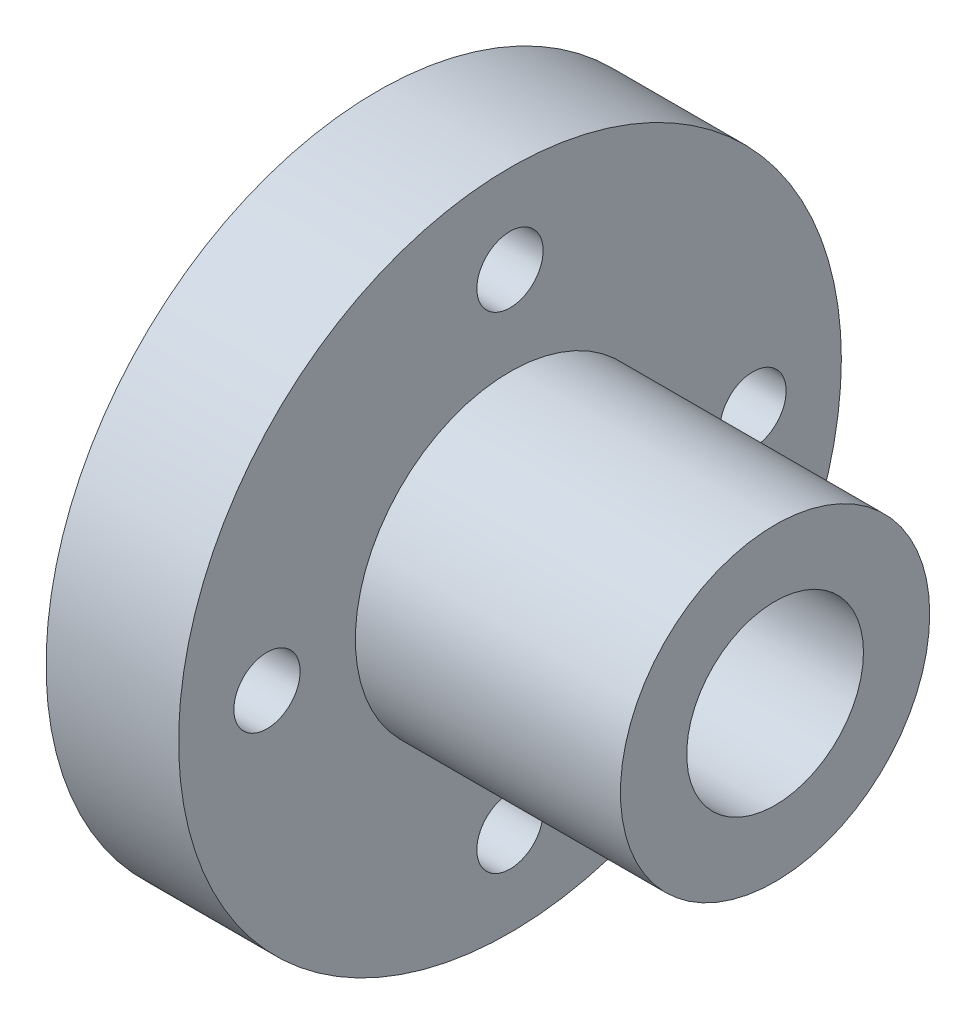
ISO-10303-21;
HEADER;
FILE_DESCRIPTION(('STEP AP214'),'2;1');
FILE_NAME('part.step','',(''),(''),'','','');
FILE_SCHEMA(('AUTOMOTIVE_DESIGN { 1 0 10303 214 1 1 1 1 }'));
ENDSEC;
DATA;
#1=APPLICATION_CONTEXT('core data for automotive mechanical design processes');
#2=APPLICATION_PROTOCOL_DEFINITION('international standard','automotive_design',2000,#1);
#3=PRODUCT_CONTEXT('',#1,'mechanical');
#4=PRODUCT('Part','Part','',(#3));
#5=PRODUCT_RELATED_PRODUCT_CATEGORY('part','',(#4));
#6=PRODUCT_DEFINITION_FORMATION('','',#4);
#7=PRODUCT_DEFINITION_CONTEXT('part definition',#1,'design');
#8=PRODUCT_DEFINITION('design','',#6,#7);
#9=PRODUCT_DEFINITION_SHAPE('','',#8);
#10=(LENGTH_UNIT() NAMED_UNIT(*) SI_UNIT(.MILLI.,.METRE.));
#11=(NAMED_UNIT(*) PLANE_ANGLE_UNIT() SI_UNIT($,.RADIAN.));
#12=(NAMED_UNIT(*) SI_UNIT($,.STERADIAN.) SOLID_ANGLE_UNIT());
#13=UNCERTAINTY_MEASURE_WITH_UNIT(LENGTH_MEASURE(1.E-05),#10,'distance_accuracy_value','');
#14=(GEOMETRIC_REPRESENTATION_CONTEXT(3) GLOBAL_UNCERTAINTY_ASSIGNED_CONTEXT((#13)) GLOBAL_UNIT_ASSIGNED_CONTEXT((#10,
#11,#12)) REPRESENTATION_CONTEXT('',''));
#15=CARTESIAN_POINT('',(0.,0.,0.));
#16=DIRECTION('',(0.,0.,1.));
#17=DIRECTION('',(1.,0.,0.));
#18=AXIS2_PLACEMENT_3D('',#15,#16,#17);
#19=CARTESIAN_POINT('',(8.,0.,0.));
#20=DIRECTION('',(1.,0.,0.));
#21=DIRECTION('',(0.,0.,-1.));
#22=AXIS2_PLACEMENT_3D('',#19,#20,#21);
#23=CYLINDRICAL_SURFACE('',#22,7.);
#24=CARTESIAN_POINT('',(0.,0.,0.));
#25=DIRECTION('',(1.,0.,0.));
#26=DIRECTION('',(0.,0.,-1.));
#27=AXIS2_PLACEMENT_3D('',#24,#25,#26);
#28=CIRCLE('',#27,6.99999999999999);
#29=CARTESIAN_POINT('',(0.,0.,-6.99999999999999));
#30=VERTEX_POINT('',#29);
#31=EDGE_CURVE('E10',#30,#30,#28,.T.);
#32=ORIENTED_EDGE('',*,*,#31,.T.);
#33=EDGE_LOOP('',(#32));
#34=FACE_BOUND('',#33,.T.);
#35=CARTESIAN_POINT('',(2.,0.,0.));
#36=DIRECTION('',(1.,0.,0.));
#37=DIRECTION('',(0.,0.,-1.));
#38=AXIS2_PLACEMENT_3D('',#35,#36,#37);
#39=CIRCLE('',#38,7.);
#40=CARTESIAN_POINT('',(2.,0.,-7.));
#41=VERTEX_POINT('',#40);
#42=EDGE_CURVE('E58',#41,#41,#39,.T.);
#43=ORIENTED_EDGE('',*,*,#42,.F.);
#44=EDGE_LOOP('',(#43));
#45=FACE_BOUND('',#44,.T.);
#46=ADVANCED_FACE('F30',(#34,#45),#23,.T.);
#47=CARTESIAN_POINT('',(0.,3.99999999999999,0.));
#48=DIRECTION('',(-1.,0.,0.));
#49=DIRECTION('',(0.,0.,1.));
#50=AXIS2_PLACEMENT_3D('',#47,#48,#49);
#51=PLANE('',#50);
#52=CARTESIAN_POINT('',(0.,0.,0.));
#53=DIRECTION('',(1.,0.,0.));
#54=DIRECTION('',(0.,0.,-1.));
#55=AXIS2_PLACEMENT_3D('',#52,#53,#54);
#56=CIRCLE('',#55,3.99999999999999);
#57=CARTESIAN_POINT('',(0.,0.,-3.99999999999999));
#58=VERTEX_POINT('',#57);
#59=EDGE_CURVE('E36',#58,#58,#56,.T.);
#60=ORIENTED_EDGE('',*,*,#59,.T.);
#61=EDGE_LOOP('',(#60));
#62=FACE_BOUND('',#61,.T.);
#63=ORIENTED_EDGE('',*,*,#31,.F.);
#64=EDGE_LOOP('',(#63));
#65=FACE_BOUND('',#64,.T.);
#66=ADVANCED_FACE('F131',(#62,#65),#51,.T.);
#67=CARTESIAN_POINT('',(8.,0.,0.));
#68=DIRECTION('',(1.,0.,0.));
#69=DIRECTION('',(0.,0.,-1.));
#70=AXIS2_PLACEMENT_3D('',#67,#68,#69);
#71=CYLINDRICAL_SURFACE('',#70,4.);
#72=CARTESIAN_POINT('',(20.,0.,0.));
#73=DIRECTION('',(1.,0.,0.));
#74=DIRECTION('',(0.,0.,-1.));
#75=AXIS2_PLACEMENT_3D('',#72,#73,#74);
#76=CIRCLE('',#75,4.);
#77=CARTESIAN_POINT('',(20.,0.,-4.));
#78=VERTEX_POINT('',#77);
#79=EDGE_CURVE('E40',#78,#78,#76,.T.);
#80=ORIENTED_EDGE('',*,*,#79,.T.);
#81=EDGE_LOOP('',(#80));
#82=FACE_BOUND('',#81,.T.);
#83=ORIENTED_EDGE('',*,*,#59,.F.);
#84=EDGE_LOOP('',(#83));
#85=FACE_BOUND('',#84,.T.);
#86=ADVANCED_FACE('F125',(#82,#85),#71,.F.);
#87=CARTESIAN_POINT('',(20.,7.,0.));
#88=DIRECTION('',(1.,0.,0.));
#89=DIRECTION('',(0.,0.,-1.));
#90=AXIS2_PLACEMENT_3D('',#87,#88,#89);
#91=PLANE('',#90);
#92=CARTESIAN_POINT('',(20.,0.,0.));
#93=DIRECTION('',(1.,0.,0.));
#94=DIRECTION('',(0.,0.,-1.));
#95=AXIS2_PLACEMENT_3D('',#92,#93,#94);
#96=CIRCLE('',#95,7.);
#97=CARTESIAN_POINT('',(20.,0.,-7.));
#98=VERTEX_POINT('',#97);
#99=EDGE_CURVE('E44',#98,#98,#96,.T.);
#100=ORIENTED_EDGE('',*,*,#99,.T.);
#101=EDGE_LOOP('',(#100));
#102=FACE_BOUND('',#101,.T.);
#103=ORIENTED_EDGE('',*,*,#79,.F.);
#104=EDGE_LOOP('',(#103));
#105=FACE_BOUND('',#104,.T.);
#106=ADVANCED_FACE('F119',(#102,#105),#91,.T.);
#107=CARTESIAN_POINT('',(8.,0.,0.));
#108=DIRECTION('',(1.,0.,0.));
#109=DIRECTION('',(0.,0.,-1.));
#110=AXIS2_PLACEMENT_3D('',#107,#108,#109);
#111=CYLINDRICAL_SURFACE('',#110,7.);
#112=CARTESIAN_POINT('',(8.,0.,0.));
#113=DIRECTION('',(1.,0.,0.));
#114=DIRECTION('',(0.,0.,-1.));
#115=AXIS2_PLACEMENT_3D('',#112,#113,#114);
#116=CIRCLE('',#115,7.);
#117=CARTESIAN_POINT('',(8.,0.,-7.));
#118=VERTEX_POINT('',#117);
#119=EDGE_CURVE('E49',#118,#118,#116,.T.);
#120=ORIENTED_EDGE('',*,*,#119,.T.);
#121=EDGE_LOOP('',(#120));
#122=FACE_BOUND('',#121,.T.);
#123=ORIENTED_EDGE('',*,*,#99,.F.);
#124=EDGE_LOOP('',(#123));
#125=FACE_BOUND('',#124,.T.);
#126=ADVANCED_FACE('F112',(#122,#125),#111,.T.);
#127=CARTESIAN_POINT('',(8.,15.,0.));
#128=DIRECTION('',(1.,0.,0.));
#129=DIRECTION('',(0.,0.,-1.));
#130=AXIS2_PLACEMENT_3D('',#127,#128,#129);
#131=PLANE('',#130);
#132=CARTESIAN_POINT('',(8.,0.,11.));
#133=DIRECTION('',(1.,0.,0.));
#134=DIRECTION('',(0.,0.,-1.));
#135=AXIS2_PLACEMENT_3D('',#132,#133,#134);
#136=CIRCLE('',#135,1.5);
#137=CARTESIAN_POINT('',(8.,0.,9.5));
#138=VERTEX_POINT('',#137);
#139=EDGE_CURVE('E79',#138,#138,#136,.T.);
#140=ORIENTED_EDGE('',*,*,#139,.F.);
#141=EDGE_LOOP('',(#140));
#142=FACE_BOUND('',#141,.T.);
#143=CARTESIAN_POINT('',(8.,-11.,0.));
#144=DIRECTION('',(1.,0.,0.));
#145=DIRECTION('',(0.,0.,-1.));
#146=AXIS2_PLACEMENT_3D('',#143,#144,#145);
#147=CIRCLE('',#146,1.5);
#148=CARTESIAN_POINT('',(8.,-11.,-1.5));
#149=VERTEX_POINT('',#148);
#150=EDGE_CURVE('E73',#149,#149,#147,.T.);
#151=ORIENTED_EDGE('',*,*,#150,.F.);
#152=EDGE_LOOP('',(#151));
#153=FACE_BOUND('',#152,.T.);
#154=CARTESIAN_POINT('',(8.,0.,-11.));
#155=DIRECTION('',(1.,0.,0.));
#156=DIRECTION('',(0.,0.,-1.));
#157=AXIS2_PLACEMENT_3D('',#154,#155,#156);
#158=CIRCLE('',#157,1.5);
#159=CARTESIAN_POINT('',(8.,0.,-12.5));
#160=VERTEX_POINT('',#159);
#161=EDGE_CURVE('E67',#160,#160,#158,.T.);
#162=ORIENTED_EDGE('',*,*,#161,.F.);
#163=EDGE_LOOP('',(#162));
#164=FACE_BOUND('',#163,.T.);
#165=CARTESIAN_POINT('',(8.,11.,0.));
#166=DIRECTION('',(1.,0.,0.));
#167=DIRECTION('',(0.,0.,-1.));
#168=AXIS2_PLACEMENT_3D('',#165,#166,#167);
#169=CIRCLE('',#168,1.5);
#170=CARTESIAN_POINT('',(8.,11.,-1.5));
#171=VERTEX_POINT('',#170);
#172=EDGE_CURVE('E61',#171,#171,#169,.T.);
#173=ORIENTED_EDGE('',*,*,#172,.F.);
#174=EDGE_LOOP('',(#173));
#175=FACE_BOUND('',#174,.T.);
#176=CARTESIAN_POINT('',(8.,0.,0.));
#177=DIRECTION('',(1.,0.,0.));
#178=DIRECTION('',(0.,0.,-1.));
#179=AXIS2_PLACEMENT_3D('',#176,#177,#178);
#180=CIRCLE('',#179,15.);
#181=CARTESIAN_POINT('',(8.,0.,-15.));
#182=VERTEX_POINT('',#181);
#183=EDGE_CURVE('E52',#182,#182,#180,.T.);
#184=ORIENTED_EDGE('',*,*,#183,.T.);
#185=EDGE_LOOP('',(#184));
#186=FACE_BOUND('',#185,.T.);
#187=ORIENTED_EDGE('',*,*,#119,.F.);
#188=EDGE_LOOP('',(#187));
#189=FACE_BOUND('',#188,.T.);
#190=ADVANCED_FACE('F106',(#142,#153,#164,#175,#186,#189),#131,.T.);
#191=CARTESIAN_POINT('',(8.,0.,0.));
#192=DIRECTION('',(1.,0.,0.));
#193=DIRECTION('',(0.,0.,-1.));
#194=AXIS2_PLACEMENT_3D('',#191,#192,#193);
#195=CYLINDRICAL_SURFACE('',#194,15.);
#196=CARTESIAN_POINT('',(2.,0.,0.));
#197=DIRECTION('',(1.,0.,0.));
#198=DIRECTION('',(0.,0.,-1.));
#199=AXIS2_PLACEMENT_3D('',#196,#197,#198);
#200=CIRCLE('',#199,15.);
#201=CARTESIAN_POINT('',(2.,0.,-15.));
#202=VERTEX_POINT('',#201);
#203=EDGE_CURVE('E55',#202,#202,#200,.T.);
#204=ORIENTED_EDGE('',*,*,#203,.T.);
#205=EDGE_LOOP('',(#204));
#206=FACE_BOUND('',#205,.T.);
#207=ORIENTED_EDGE('',*,*,#183,.F.);
#208=EDGE_LOOP('',(#207));
#209=FACE_BOUND('',#208,.T.);
#210=ADVANCED_FACE('F92',(#206,#209),#195,.T.);
#211=CARTESIAN_POINT('',(2.,7.,0.));
#212=DIRECTION('',(-1.,0.,0.));
#213=DIRECTION('',(0.,0.,1.));
#214=AXIS2_PLACEMENT_3D('',#211,#212,#213);
#215=PLANE('',#214);
#216=CARTESIAN_POINT('',(2.,0.,11.));
#217=DIRECTION('',(-1.,0.,0.));
#218=DIRECTION('',(0.,0.,1.));
#219=AXIS2_PLACEMENT_3D('',#216,#217,#218);
#220=CIRCLE('',#219,1.5);
#221=CARTESIAN_POINT('',(2.,0.,12.5));
#222=VERTEX_POINT('',#221);
#223=EDGE_CURVE('E82',#222,#222,#220,.T.);
#224=ORIENTED_EDGE('',*,*,#223,.F.);
#225=EDGE_LOOP('',(#224));
#226=FACE_BOUND('',#225,.T.);
#227=CARTESIAN_POINT('',(2.,-11.,0.));
#228=DIRECTION('',(-1.,0.,0.));
#229=DIRECTION('',(0.,0.,1.));
#230=AXIS2_PLACEMENT_3D('',#227,#228,#229);
#231=CIRCLE('',#230,1.5);
#232=CARTESIAN_POINT('',(2.,-11.,1.5));
#233=VERTEX_POINT('',#232);
#234=EDGE_CURVE('E76',#233,#233,#231,.T.);
#235=ORIENTED_EDGE('',*,*,#234,.F.);
#236=EDGE_LOOP('',(#235));
#237=FACE_BOUND('',#236,.T.);
#238=CARTESIAN_POINT('',(2.,0.,-11.));
#239=DIRECTION('',(-1.,0.,0.));
#240=DIRECTION('',(0.,0.,1.));
#241=AXIS2_PLACEMENT_3D('',#238,#239,#240);
#242=CIRCLE('',#241,1.5);
#243=CARTESIAN_POINT('',(2.,0.,-9.5));
#244=VERTEX_POINT('',#243);
#245=EDGE_CURVE('E70',#244,#244,#242,.T.);
#246=ORIENTED_EDGE('',*,*,#245,.F.);
#247=EDGE_LOOP('',(#246));
#248=FACE_BOUND('',#247,.T.);
#249=CARTESIAN_POINT('',(2.,11.,0.));
#250=DIRECTION('',(-1.,0.,0.));
#251=DIRECTION('',(0.,0.,1.));
#252=AXIS2_PLACEMENT_3D('',#249,#250,#251);
#253=CIRCLE('',#252,1.5);
#254=CARTESIAN_POINT('',(2.,11.,1.5));
#255=VERTEX_POINT('',#254);
#256=EDGE_CURVE('E64',#255,#255,#253,.T.);
#257=ORIENTED_EDGE('',*,*,#256,.F.);
#258=EDGE_LOOP('',(#257));
#259=FACE_BOUND('',#258,.T.);
#260=ORIENTED_EDGE('',*,*,#42,.T.);
#261=EDGE_LOOP('',(#260));
#262=FACE_BOUND('',#261,.T.);
#263=ORIENTED_EDGE('',*,*,#203,.F.);
#264=EDGE_LOOP('',(#263));
#265=FACE_BOUND('',#264,.T.);
#266=ADVANCED_FACE('F88',(#226,#237,#248,#259,#262,#265),#215,.T.);
#267=CARTESIAN_POINT('',(20.,11.,0.));
#268=DIRECTION('',(-1.,0.,0.));
#269=DIRECTION('',(0.,0.,1.));
#270=AXIS2_PLACEMENT_3D('',#267,#268,#269);
#271=CYLINDRICAL_SURFACE('',#270,1.5);
#272=ORIENTED_EDGE('',*,*,#172,.T.);
#273=EDGE_LOOP('',(#272));
#274=FACE_BOUND('',#273,.T.);
#275=ORIENTED_EDGE('',*,*,#256,.T.);
#276=EDGE_LOOP('',(#275));
#277=FACE_BOUND('',#276,.T.);
#278=ADVANCED_FACE('F91',(#274,#277),#271,.F.);
#279=CARTESIAN_POINT('',(20.,0.,-11.));
#280=DIRECTION('',(-1.,0.,0.));
#281=DIRECTION('',(0.,0.,1.));
#282=AXIS2_PLACEMENT_3D('',#279,#280,#281);
#283=CYLINDRICAL_SURFACE('',#282,1.5);
#284=ORIENTED_EDGE('',*,*,#161,.T.);
#285=EDGE_LOOP('',(#284));
#286=FACE_BOUND('',#285,.T.);
#287=ORIENTED_EDGE('',*,*,#245,.T.);
#288=EDGE_LOOP('',(#287));
#289=FACE_BOUND('',#288,.T.);
#290=ADVANCED_FACE('F187',(#286,#289),#283,.F.);
#291=CARTESIAN_POINT('',(20.,-11.,0.));
#292=DIRECTION('',(-1.,0.,0.));
#293=DIRECTION('',(0.,0.,1.));
#294=AXIS2_PLACEMENT_3D('',#291,#292,#293);
#295=CYLINDRICAL_SURFACE('',#294,1.5);
#296=ORIENTED_EDGE('',*,*,#150,.T.);
#297=EDGE_LOOP('',(#296));
#298=FACE_BOUND('',#297,.T.);
#299=ORIENTED_EDGE('',*,*,#234,.T.);
#300=EDGE_LOOP('',(#299));
#301=FACE_BOUND('',#300,.T.);
#302=ADVANCED_FACE('F197',(#298,#301),#295,.F.);
#303=CARTESIAN_POINT('',(20.,0.,11.));
#304=DIRECTION('',(-1.,0.,0.));
#305=DIRECTION('',(0.,0.,1.));
#306=AXIS2_PLACEMENT_3D('',#303,#304,#305);
#307=CYLINDRICAL_SURFACE('',#306,1.5);
#308=ORIENTED_EDGE('',*,*,#139,.T.);
#309=EDGE_LOOP('',(#308));
#310=FACE_BOUND('',#309,.T.);
#311=ORIENTED_EDGE('',*,*,#223,.T.);
#312=EDGE_LOOP('',(#311));
#313=FACE_BOUND('',#312,.T.);
#314=ADVANCED_FACE('F86',(#310,#313),#307,.F.);
#315=CLOSED_SHELL('',(#46,#66,#86,#106,#126,#190,#210,#266,#278,#290,#302,#314));
#316=MANIFOLD_SOLID_BREP('B2',#315);
#317=ADVANCED_BREP_SHAPE_REPRESENTATION('',(#18,#316),#14);
#318=SHAPE_DEFINITION_REPRESENTATION(#9,#317);
ENDSEC;
END-ISO-10303-21;
